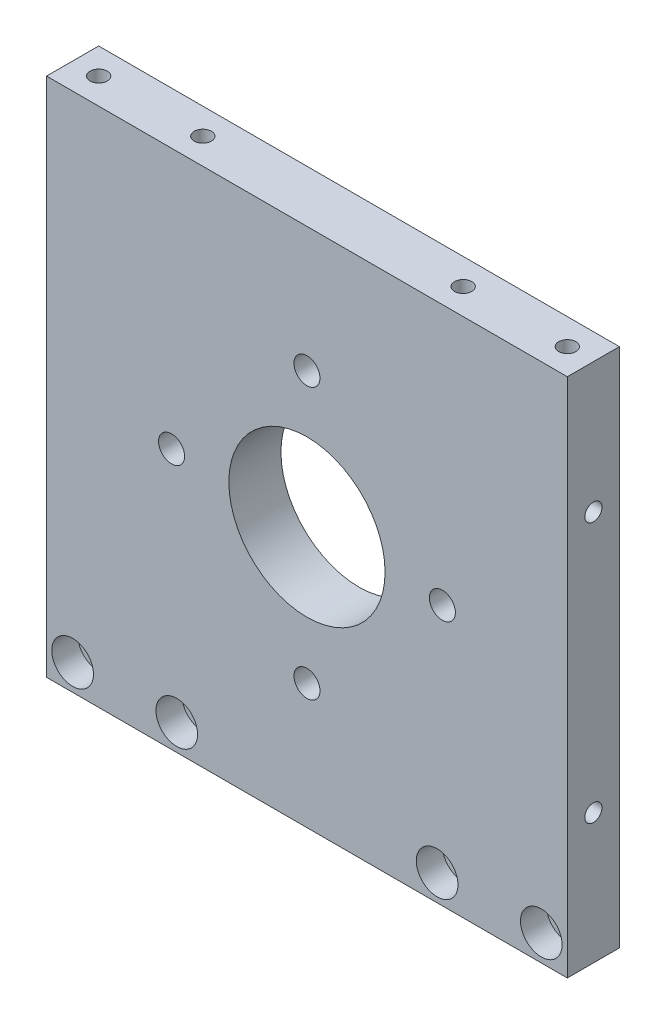
ISO-10303-21;
HEADER;
FILE_DESCRIPTION(('STEP AP214'),'2;1');
FILE_NAME('part.step','',(''),(''),'','','');
FILE_SCHEMA(('AUTOMOTIVE_DESIGN { 1 0 10303 214 1 1 1 1 }'));
ENDSEC;
DATA;
#1=APPLICATION_CONTEXT('core data for automotive mechanical design processes');
#2=APPLICATION_PROTOCOL_DEFINITION('international standard','automotive_design',2000,#1);
#3=PRODUCT_CONTEXT('',#1,'mechanical');
#4=PRODUCT('Part','Part','',(#3));
#5=PRODUCT_RELATED_PRODUCT_CATEGORY('part','',(#4));
#6=PRODUCT_DEFINITION_FORMATION('','',#4);
#7=PRODUCT_DEFINITION_CONTEXT('part definition',#1,'design');
#8=PRODUCT_DEFINITION('design','',#6,#7);
#9=PRODUCT_DEFINITION_SHAPE('','',#8);
#10=(LENGTH_UNIT() NAMED_UNIT(*) SI_UNIT(.MILLI.,.METRE.));
#11=(NAMED_UNIT(*) PLANE_ANGLE_UNIT() SI_UNIT($,.RADIAN.));
#12=(NAMED_UNIT(*) SI_UNIT($,.STERADIAN.) SOLID_ANGLE_UNIT());
#13=UNCERTAINTY_MEASURE_WITH_UNIT(LENGTH_MEASURE(1.E-05),#10,'distance_accuracy_value','');
#14=(GEOMETRIC_REPRESENTATION_CONTEXT(3) GLOBAL_UNCERTAINTY_ASSIGNED_CONTEXT((#13)) GLOBAL_UNIT_ASSIGNED_CONTEXT((#10,
#11,#12)) REPRESENTATION_CONTEXT('',''));
#15=CARTESIAN_POINT('',(0.,0.,0.));
#16=DIRECTION('',(0.,0.,1.));
#17=DIRECTION('',(1.,0.,0.));
#18=AXIS2_PLACEMENT_3D('',#15,#16,#17);
#19=CARTESIAN_POINT('',(50.,50.,-5.));
#20=DIRECTION('',(0.,-1.,0.));
#21=DIRECTION('',(0.,0.,-1.));
#22=AXIS2_PLACEMENT_3D('',#19,#20,#21);
#23=PLANE('',#22);
#24=CARTESIAN_POINT('',(-45.,50.,0.));
#25=DIRECTION('',(0.,1.,0.));
#26=DIRECTION('',(0.,0.,1.));
#27=AXIS2_PLACEMENT_3D('',#24,#25,#26);
#28=CIRCLE('',#27,1.64999999999999);
#29=CARTESIAN_POINT('',(-45.,50.,1.65000000000003));
#30=VERTEX_POINT('',#29);
#31=EDGE_CURVE('E182',#30,#30,#28,.T.);
#32=ORIENTED_EDGE('',*,*,#31,.F.);
#33=EDGE_LOOP('',(#32));
#34=FACE_BOUND('',#33,.T.);
#35=CARTESIAN_POINT('',(-25.,50.,0.));
#36=DIRECTION('',(0.,1.,0.));
#37=DIRECTION('',(0.,0.,1.));
#38=AXIS2_PLACEMENT_3D('',#35,#36,#37);
#39=CIRCLE('',#38,1.64999999999999);
#40=CARTESIAN_POINT('',(-25.,50.,1.65000000000002));
#41=VERTEX_POINT('',#40);
#42=EDGE_CURVE('E190',#41,#41,#39,.T.);
#43=ORIENTED_EDGE('',*,*,#42,.F.);
#44=EDGE_LOOP('',(#43));
#45=FACE_BOUND('',#44,.T.);
#46=CARTESIAN_POINT('',(25.,50.,0.));
#47=DIRECTION('',(0.,1.,0.));
#48=DIRECTION('',(0.,0.,1.));
#49=AXIS2_PLACEMENT_3D('',#46,#47,#48);
#50=CIRCLE('',#49,1.64999999999999);
#51=CARTESIAN_POINT('',(25.,50.,1.65000000000001));
#52=VERTEX_POINT('',#51);
#53=EDGE_CURVE('E198',#52,#52,#50,.T.);
#54=ORIENTED_EDGE('',*,*,#53,.F.);
#55=EDGE_LOOP('',(#54));
#56=FACE_BOUND('',#55,.T.);
#57=CARTESIAN_POINT('',(45.,50.,0.));
#58=DIRECTION('',(0.,1.,0.));
#59=DIRECTION('',(0.,0.,1.));
#60=AXIS2_PLACEMENT_3D('',#57,#58,#59);
#61=CIRCLE('',#60,1.64999999999999);
#62=CARTESIAN_POINT('',(45.,50.,1.65000000000001));
#63=VERTEX_POINT('',#62);
#64=EDGE_CURVE('E206',#63,#63,#61,.T.);
#65=ORIENTED_EDGE('',*,*,#64,.F.);
#66=EDGE_LOOP('',(#65));
#67=FACE_BOUND('',#66,.T.);
#68=DIRECTION('',(0.,0.,1.));
#69=VECTOR('',#68,1.);
#70=CARTESIAN_POINT('',(-50.,50.,-5.));
#71=LINE('',#70,#69);
#72=CARTESIAN_POINT('',(-50.,50.,-5.));
#73=VERTEX_POINT('',#72);
#74=CARTESIAN_POINT('',(-50.,50.,5.));
#75=VERTEX_POINT('',#74);
#76=EDGE_CURVE('E283',#73,#75,#71,.T.);
#77=ORIENTED_EDGE('',*,*,#76,.T.);
#78=DIRECTION('',(-1.,0.,0.));
#79=VECTOR('',#78,1.);
#80=CARTESIAN_POINT('',(50.,50.,5.));
#81=LINE('',#80,#79);
#82=CARTESIAN_POINT('',(50.,50.,5.));
#83=VERTEX_POINT('',#82);
#84=EDGE_CURVE('E11',#83,#75,#81,.T.);
#85=ORIENTED_EDGE('',*,*,#84,.F.);
#86=DIRECTION('',(0.,0.,1.));
#87=VECTOR('',#86,1.);
#88=CARTESIAN_POINT('',(50.,50.,-5.));
#89=LINE('',#88,#87);
#90=CARTESIAN_POINT('',(50.,50.,-5.));
#91=VERTEX_POINT('',#90);
#92=EDGE_CURVE('E287',#91,#83,#89,.T.);
#93=ORIENTED_EDGE('',*,*,#92,.F.);
#94=DIRECTION('',(-1.,0.,0.));
#95=VECTOR('',#94,1.);
#96=CARTESIAN_POINT('',(50.,50.,-5.));
#97=LINE('',#96,#95);
#98=EDGE_CURVE('E297',#91,#73,#97,.T.);
#99=ORIENTED_EDGE('',*,*,#98,.T.);
#100=EDGE_LOOP('',(#77,#85,#93,#99));
#101=FACE_BOUND('',#100,.T.);
#102=ADVANCED_FACE('F57',(#34,#45,#56,#67,#101),#23,.F.);
#103=CARTESIAN_POINT('',(50.,50.,5.));
#104=DIRECTION('',(0.,0.,-1.));
#105=DIRECTION('',(0.,1.,0.));
#106=AXIS2_PLACEMENT_3D('',#103,#104,#105);
#107=PLANE('',#106);
#108=CARTESIAN_POINT('',(0.,26.,5.));
#109=DIRECTION('',(0.,0.,1.));
#110=DIRECTION('',(1.,0.,0.));
#111=AXIS2_PLACEMENT_3D('',#108,#109,#110);
#112=CIRCLE('',#111,2.5);
#113=CARTESIAN_POINT('',(2.49999999999999,26.,5.));
#114=VERTEX_POINT('',#113);
#115=EDGE_CURVE('E914',#114,#114,#112,.T.);
#116=ORIENTED_EDGE('',*,*,#115,.F.);
#117=EDGE_LOOP('',(#116));
#118=FACE_BOUND('',#117,.T.);
#119=CARTESIAN_POINT('',(-26.,0.,5.));
#120=DIRECTION('',(0.,0.,1.));
#121=DIRECTION('',(1.,0.,0.));
#122=AXIS2_PLACEMENT_3D('',#119,#120,#121);
#123=CIRCLE('',#122,2.5);
#124=CARTESIAN_POINT('',(-23.5,0.,5.));
#125=VERTEX_POINT('',#124);
#126=EDGE_CURVE('E918',#125,#125,#123,.T.);
#127=ORIENTED_EDGE('',*,*,#126,.F.);
#128=EDGE_LOOP('',(#127));
#129=FACE_BOUND('',#128,.T.);
#130=CARTESIAN_POINT('',(26.,0.,5.));
#131=DIRECTION('',(0.,0.,1.));
#132=DIRECTION('',(1.,0.,0.));
#133=AXIS2_PLACEMENT_3D('',#130,#131,#132);
#134=CIRCLE('',#133,2.5);
#135=CARTESIAN_POINT('',(28.5,0.,5.));
#136=VERTEX_POINT('',#135);
#137=EDGE_CURVE('E928',#136,#136,#134,.T.);
#138=ORIENTED_EDGE('',*,*,#137,.F.);
#139=EDGE_LOOP('',(#138));
#140=FACE_BOUND('',#139,.T.);
#141=CARTESIAN_POINT('',(0.,-26.,5.));
#142=DIRECTION('',(0.,0.,1.));
#143=DIRECTION('',(1.,0.,0.));
#144=AXIS2_PLACEMENT_3D('',#141,#142,#143);
#145=CIRCLE('',#144,2.5);
#146=CARTESIAN_POINT('',(2.49999999999999,-26.,5.));
#147=VERTEX_POINT('',#146);
#148=EDGE_CURVE('E936',#147,#147,#145,.T.);
#149=ORIENTED_EDGE('',*,*,#148,.F.);
#150=EDGE_LOOP('',(#149));
#151=FACE_BOUND('',#150,.T.);
#152=CARTESIAN_POINT('',(-45.,-45.,5.));
#153=DIRECTION('',(0.,0.,1.));
#154=DIRECTION('',(1.,0.,0.));
#155=AXIS2_PLACEMENT_3D('',#152,#153,#154);
#156=CIRCLE('',#155,4.);
#157=CARTESIAN_POINT('',(-41.,-45.,5.));
#158=VERTEX_POINT('',#157);
#159=EDGE_CURVE('E214',#158,#158,#156,.T.);
#160=ORIENTED_EDGE('',*,*,#159,.F.);
#161=EDGE_LOOP('',(#160));
#162=FACE_BOUND('',#161,.T.);
#163=CARTESIAN_POINT('',(-25.,-45.,5.));
#164=DIRECTION('',(0.,0.,1.));
#165=DIRECTION('',(1.,0.,0.));
#166=AXIS2_PLACEMENT_3D('',#163,#164,#165);
#167=CIRCLE('',#166,4.);
#168=CARTESIAN_POINT('',(-21.,-45.,5.));
#169=VERTEX_POINT('',#168);
#170=EDGE_CURVE('E230',#169,#169,#167,.T.);
#171=ORIENTED_EDGE('',*,*,#170,.F.);
#172=EDGE_LOOP('',(#171));
#173=FACE_BOUND('',#172,.T.);
#174=CARTESIAN_POINT('',(25.,-45.,5.));
#175=DIRECTION('',(0.,0.,1.));
#176=DIRECTION('',(1.,0.,0.));
#177=AXIS2_PLACEMENT_3D('',#174,#175,#176);
#178=CIRCLE('',#177,4.);
#179=CARTESIAN_POINT('',(29.,-45.,5.));
#180=VERTEX_POINT('',#179);
#181=EDGE_CURVE('E246',#180,#180,#178,.T.);
#182=ORIENTED_EDGE('',*,*,#181,.F.);
#183=EDGE_LOOP('',(#182));
#184=FACE_BOUND('',#183,.T.);
#185=CARTESIAN_POINT('',(45.,-45.,5.));
#186=DIRECTION('',(0.,0.,1.));
#187=DIRECTION('',(1.,0.,0.));
#188=AXIS2_PLACEMENT_3D('',#185,#186,#187);
#189=CIRCLE('',#188,4.);
#190=CARTESIAN_POINT('',(49.,-45.,5.));
#191=VERTEX_POINT('',#190);
#192=EDGE_CURVE('E262',#191,#191,#189,.T.);
#193=ORIENTED_EDGE('',*,*,#192,.F.);
#194=EDGE_LOOP('',(#193));
#195=FACE_BOUND('',#194,.T.);
#196=CARTESIAN_POINT('',(0.,0.,5.));
#197=DIRECTION('',(0.,0.,1.));
#198=DIRECTION('',(1.,0.,0.));
#199=AXIS2_PLACEMENT_3D('',#196,#197,#198);
#200=CIRCLE('',#199,15.);
#201=CARTESIAN_POINT('',(15.,0.,5.));
#202=VERTEX_POINT('',#201);
#203=EDGE_CURVE('E278',#202,#202,#200,.T.);
#204=ORIENTED_EDGE('',*,*,#203,.F.);
#205=EDGE_LOOP('',(#204));
#206=FACE_BOUND('',#205,.T.);
#207=DIRECTION('',(0.,-1.,0.));
#208=VECTOR('',#207,1.);
#209=CARTESIAN_POINT('',(-50.,50.,5.));
#210=LINE('',#209,#208);
#211=CARTESIAN_POINT('',(-50.,-50.,4.99999999999999));
#212=VERTEX_POINT('',#211);
#213=EDGE_CURVE('E301',#75,#212,#210,.T.);
#214=ORIENTED_EDGE('',*,*,#213,.T.);
#215=DIRECTION('',(-1.,0.,0.));
#216=VECTOR('',#215,1.);
#217=CARTESIAN_POINT('',(50.,-50.,4.99999999999999));
#218=LINE('',#217,#216);
#219=CARTESIAN_POINT('',(50.,-50.,4.99999999999999));
#220=VERTEX_POINT('',#219);
#221=EDGE_CURVE('E66',#220,#212,#218,.T.);
#222=ORIENTED_EDGE('',*,*,#221,.F.);
#223=DIRECTION('',(0.,-1.,0.));
#224=VECTOR('',#223,1.);
#225=CARTESIAN_POINT('',(50.,50.,5.));
#226=LINE('',#225,#224);
#227=EDGE_CURVE('E111',#83,#220,#226,.T.);
#228=ORIENTED_EDGE('',*,*,#227,.F.);
#229=ORIENTED_EDGE('',*,*,#84,.T.);
#230=EDGE_LOOP('',(#214,#222,#228,#229));
#231=FACE_BOUND('',#230,.T.);
#232=ADVANCED_FACE('F334',(#118,#129,#140,#151,#162,#173,#184,#195,#206,#231),#107,.F.);
#233=CARTESIAN_POINT('',(50.,-50.,4.99999999999999));
#234=DIRECTION('',(0.,1.,0.));
#235=DIRECTION('',(0.,0.,1.));
#236=AXIS2_PLACEMENT_3D('',#233,#234,#235);
#237=PLANE('',#236);
#238=DIRECTION('',(0.,0.,-1.));
#239=VECTOR('',#238,1.);
#240=CARTESIAN_POINT('',(-50.,-50.,4.99999999999999));
#241=LINE('',#240,#239);
#242=CARTESIAN_POINT('',(-50.,-50.,-5.));
#243=VERTEX_POINT('',#242);
#244=EDGE_CURVE('E96',#212,#243,#241,.T.);
#245=ORIENTED_EDGE('',*,*,#244,.T.);
#246=DIRECTION('',(-1.,0.,0.));
#247=VECTOR('',#246,1.);
#248=CARTESIAN_POINT('',(50.,-50.,-5.));
#249=LINE('',#248,#247);
#250=CARTESIAN_POINT('',(50.,-50.,-5.));
#251=VERTEX_POINT('',#250);
#252=EDGE_CURVE('E310',#251,#243,#249,.T.);
#253=ORIENTED_EDGE('',*,*,#252,.F.);
#254=DIRECTION('',(0.,0.,-1.));
#255=VECTOR('',#254,1.);
#256=CARTESIAN_POINT('',(50.,-50.,4.99999999999999));
#257=LINE('',#256,#255);
#258=EDGE_CURVE('E292',#220,#251,#257,.T.);
#259=ORIENTED_EDGE('',*,*,#258,.F.);
#260=ORIENTED_EDGE('',*,*,#221,.T.);
#261=EDGE_LOOP('',(#245,#253,#259,#260));
#262=FACE_BOUND('',#261,.T.);
#263=ADVANCED_FACE('F316',(#262),#237,.F.);
#264=CARTESIAN_POINT('',(50.,-50.,-5.));
#265=DIRECTION('',(0.,0.,1.));
#266=DIRECTION('',(1.,0.,0.));
#267=AXIS2_PLACEMENT_3D('',#264,#265,#266);
#268=PLANE('',#267);
#269=CARTESIAN_POINT('',(0.,26.,-5.));
#270=DIRECTION('',(0.,0.,1.));
#271=DIRECTION('',(1.,0.,0.));
#272=AXIS2_PLACEMENT_3D('',#269,#270,#271);
#273=CIRCLE('',#272,2.5);
#274=CARTESIAN_POINT('',(2.49999999999999,26.,-5.));
#275=VERTEX_POINT('',#274);
#276=EDGE_CURVE('E911',#275,#275,#273,.T.);
#277=ORIENTED_EDGE('',*,*,#276,.T.);
#278=EDGE_LOOP('',(#277));
#279=FACE_BOUND('',#278,.T.);
#280=CARTESIAN_POINT('',(-26.,0.,-5.));
#281=DIRECTION('',(0.,0.,1.));
#282=DIRECTION('',(1.,0.,0.));
#283=AXIS2_PLACEMENT_3D('',#280,#281,#282);
#284=CIRCLE('',#283,2.5);
#285=CARTESIAN_POINT('',(-23.5,0.,-5.));
#286=VERTEX_POINT('',#285);
#287=EDGE_CURVE('E924',#286,#286,#284,.T.);
#288=ORIENTED_EDGE('',*,*,#287,.T.);
#289=EDGE_LOOP('',(#288));
#290=FACE_BOUND('',#289,.T.);
#291=CARTESIAN_POINT('',(26.,0.,-5.));
#292=DIRECTION('',(0.,0.,1.));
#293=DIRECTION('',(1.,0.,0.));
#294=AXIS2_PLACEMENT_3D('',#291,#292,#293);
#295=CIRCLE('',#294,2.5);
#296=CARTESIAN_POINT('',(28.5,0.,-5.));
#297=VERTEX_POINT('',#296);
#298=EDGE_CURVE('E932',#297,#297,#295,.T.);
#299=ORIENTED_EDGE('',*,*,#298,.T.);
#300=EDGE_LOOP('',(#299));
#301=FACE_BOUND('',#300,.T.);
#302=CARTESIAN_POINT('',(0.,-26.,-5.));
#303=DIRECTION('',(0.,0.,1.));
#304=DIRECTION('',(1.,0.,0.));
#305=AXIS2_PLACEMENT_3D('',#302,#303,#304);
#306=CIRCLE('',#305,2.5);
#307=CARTESIAN_POINT('',(2.49999999999999,-26.,-5.));
#308=VERTEX_POINT('',#307);
#309=EDGE_CURVE('E159',#308,#308,#306,.T.);
#310=ORIENTED_EDGE('',*,*,#309,.T.);
#311=EDGE_LOOP('',(#310));
#312=FACE_BOUND('',#311,.T.);
#313=CARTESIAN_POINT('',(-45.,-45.,-5.));
#314=DIRECTION('',(0.,0.,1.));
#315=DIRECTION('',(1.,0.,0.));
#316=AXIS2_PLACEMENT_3D('',#313,#314,#315);
#317=CIRCLE('',#316,2.25);
#318=CARTESIAN_POINT('',(-42.75,-45.,-5.));
#319=VERTEX_POINT('',#318);
#320=EDGE_CURVE('E226',#319,#319,#317,.T.);
#321=ORIENTED_EDGE('',*,*,#320,.T.);
#322=EDGE_LOOP('',(#321));
#323=FACE_BOUND('',#322,.T.);
#324=CARTESIAN_POINT('',(-25.,-45.,-5.));
#325=DIRECTION('',(0.,0.,1.));
#326=DIRECTION('',(1.,0.,0.));
#327=AXIS2_PLACEMENT_3D('',#324,#325,#326);
#328=CIRCLE('',#327,2.25);
#329=CARTESIAN_POINT('',(-22.75,-45.,-5.));
#330=VERTEX_POINT('',#329);
#331=EDGE_CURVE('E242',#330,#330,#328,.T.);
#332=ORIENTED_EDGE('',*,*,#331,.T.);
#333=EDGE_LOOP('',(#332));
#334=FACE_BOUND('',#333,.T.);
#335=CARTESIAN_POINT('',(25.,-45.,-5.));
#336=DIRECTION('',(0.,0.,1.));
#337=DIRECTION('',(1.,0.,0.));
#338=AXIS2_PLACEMENT_3D('',#335,#336,#337);
#339=CIRCLE('',#338,2.25);
#340=CARTESIAN_POINT('',(27.25,-45.,-5.));
#341=VERTEX_POINT('',#340);
#342=EDGE_CURVE('E258',#341,#341,#339,.T.);
#343=ORIENTED_EDGE('',*,*,#342,.T.);
#344=EDGE_LOOP('',(#343));
#345=FACE_BOUND('',#344,.T.);
#346=CARTESIAN_POINT('',(45.,-45.,-5.));
#347=DIRECTION('',(0.,0.,1.));
#348=DIRECTION('',(1.,0.,0.));
#349=AXIS2_PLACEMENT_3D('',#346,#347,#348);
#350=CIRCLE('',#349,2.25);
#351=CARTESIAN_POINT('',(47.25,-45.,-5.));
#352=VERTEX_POINT('',#351);
#353=EDGE_CURVE('E274',#352,#352,#350,.T.);
#354=ORIENTED_EDGE('',*,*,#353,.T.);
#355=EDGE_LOOP('',(#354));
#356=FACE_BOUND('',#355,.T.);
#357=CARTESIAN_POINT('',(0.,0.,-5.));
#358=DIRECTION('',(0.,0.,1.));
#359=DIRECTION('',(1.,0.,0.));
#360=AXIS2_PLACEMENT_3D('',#357,#358,#359);
#361=CIRCLE('',#360,15.);
#362=CARTESIAN_POINT('',(15.,0.,-5.));
#363=VERTEX_POINT('',#362);
#364=EDGE_CURVE('E279',#363,#363,#361,.T.);
#365=ORIENTED_EDGE('',*,*,#364,.T.);
#366=EDGE_LOOP('',(#365));
#367=FACE_BOUND('',#366,.T.);
#368=DIRECTION('',(0.,1.,0.));
#369=VECTOR('',#368,1.);
#370=CARTESIAN_POINT('',(-50.,-50.,-5.));
#371=LINE('',#370,#369);
#372=EDGE_CURVE('E104',#243,#73,#371,.T.);
#373=ORIENTED_EDGE('',*,*,#372,.T.);
#374=ORIENTED_EDGE('',*,*,#98,.F.);
#375=DIRECTION('',(0.,1.,0.));
#376=VECTOR('',#375,1.);
#377=CARTESIAN_POINT('',(50.,-50.,-5.));
#378=LINE('',#377,#376);
#379=EDGE_CURVE('E74',#251,#91,#378,.T.);
#380=ORIENTED_EDGE('',*,*,#379,.F.);
#381=ORIENTED_EDGE('',*,*,#252,.T.);
#382=EDGE_LOOP('',(#373,#374,#380,#381));
#383=FACE_BOUND('',#382,.T.);
#384=ADVANCED_FACE('F323',(#279,#290,#301,#312,#323,#334,#345,#356,#367,#383),#268,.F.);
#385=CARTESIAN_POINT('',(50.,0.,0.));
#386=DIRECTION('',(1.,0.,0.));
#387=DIRECTION('',(0.,0.,-1.));
#388=AXIS2_PLACEMENT_3D('',#385,#386,#387);
#389=PLANE('',#388);
#390=CARTESIAN_POINT('',(50.,25.,0.));
#391=DIRECTION('',(1.,0.,0.));
#392=DIRECTION('',(0.,0.,-1.));
#393=AXIS2_PLACEMENT_3D('',#390,#391,#392);
#394=CIRCLE('',#393,1.64999999999999);
#395=CARTESIAN_POINT('',(50.,25.,-1.65));
#396=VERTEX_POINT('',#395);
#397=EDGE_CURVE('E150',#396,#396,#394,.T.);
#398=ORIENTED_EDGE('',*,*,#397,.F.);
#399=EDGE_LOOP('',(#398));
#400=FACE_BOUND('',#399,.T.);
#401=CARTESIAN_POINT('',(50.,-25.,0.));
#402=DIRECTION('',(1.,0.,0.));
#403=DIRECTION('',(0.,0.,-1.));
#404=AXIS2_PLACEMENT_3D('',#401,#402,#403);
#405=CIRCLE('',#404,1.64999999999999);
#406=CARTESIAN_POINT('',(50.,-25.,-1.64999999999999));
#407=VERTEX_POINT('',#406);
#408=EDGE_CURVE('E149',#407,#407,#405,.T.);
#409=ORIENTED_EDGE('',*,*,#408,.F.);
#410=EDGE_LOOP('',(#409));
#411=FACE_BOUND('',#410,.T.);
#412=ORIENTED_EDGE('',*,*,#92,.T.);
#413=ORIENTED_EDGE('',*,*,#227,.T.);
#414=ORIENTED_EDGE('',*,*,#258,.T.);
#415=ORIENTED_EDGE('',*,*,#379,.T.);
#416=EDGE_LOOP('',(#412,#413,#414,#415));
#417=FACE_BOUND('',#416,.T.);
#418=ADVANCED_FACE('F325',(#400,#411,#417),#389,.T.);
#419=CARTESIAN_POINT('',(-50.,0.,0.));
#420=DIRECTION('',(1.,0.,0.));
#421=DIRECTION('',(0.,0.,-1.));
#422=AXIS2_PLACEMENT_3D('',#419,#420,#421);
#423=PLANE('',#422);
#424=CARTESIAN_POINT('',(-50.,25.,0.));
#425=DIRECTION('',(-1.,0.,0.));
#426=DIRECTION('',(0.,0.,1.));
#427=AXIS2_PLACEMENT_3D('',#424,#425,#426);
#428=CIRCLE('',#427,1.64999999999999);
#429=CARTESIAN_POINT('',(-50.,25.,1.64999999999998));
#430=VERTEX_POINT('',#429);
#431=EDGE_CURVE('E166',#430,#430,#428,.T.);
#432=ORIENTED_EDGE('',*,*,#431,.F.);
#433=EDGE_LOOP('',(#432));
#434=FACE_BOUND('',#433,.T.);
#435=CARTESIAN_POINT('',(-50.,-25.,0.));
#436=DIRECTION('',(-1.,0.,0.));
#437=DIRECTION('',(0.,0.,1.));
#438=AXIS2_PLACEMENT_3D('',#435,#436,#437);
#439=CIRCLE('',#438,1.64999999999999);
#440=CARTESIAN_POINT('',(-50.,-25.,1.65));
#441=VERTEX_POINT('',#440);
#442=EDGE_CURVE('E174',#441,#441,#439,.T.);
#443=ORIENTED_EDGE('',*,*,#442,.F.);
#444=EDGE_LOOP('',(#443));
#445=FACE_BOUND('',#444,.T.);
#446=ORIENTED_EDGE('',*,*,#76,.F.);
#447=ORIENTED_EDGE('',*,*,#372,.F.);
#448=ORIENTED_EDGE('',*,*,#244,.F.);
#449=ORIENTED_EDGE('',*,*,#213,.F.);
#450=EDGE_LOOP('',(#446,#447,#448,#449));
#451=FACE_BOUND('',#450,.T.);
#452=ADVANCED_FACE('F319',(#434,#445,#451),#423,.F.);
#453=CARTESIAN_POINT('',(0.,0.,-5.));
#454=DIRECTION('',(0.,0.,1.));
#455=DIRECTION('',(1.,0.,0.));
#456=AXIS2_PLACEMENT_3D('',#453,#454,#455);
#457=CYLINDRICAL_SURFACE('',#456,15.);
#458=ORIENTED_EDGE('',*,*,#364,.F.);
#459=EDGE_LOOP('',(#458));
#460=FACE_BOUND('',#459,.T.);
#461=ORIENTED_EDGE('',*,*,#203,.T.);
#462=EDGE_LOOP('',(#461));
#463=FACE_BOUND('',#462,.T.);
#464=ADVANCED_FACE('F420',(#460,#463),#457,.F.);
#465=CARTESIAN_POINT('',(45.,-45.,5.));
#466=DIRECTION('',(0.,0.,1.));
#467=DIRECTION('',(1.,0.,0.));
#468=AXIS2_PLACEMENT_3D('',#465,#466,#467);
#469=CYLINDRICAL_SURFACE('',#468,2.25);
#470=ORIENTED_EDGE('',*,*,#353,.F.);
#471=EDGE_LOOP('',(#470));
#472=FACE_BOUND('',#471,.T.);
#473=CARTESIAN_POINT('',(45.,-45.,0.));
#474=DIRECTION('',(0.,0.,1.));
#475=DIRECTION('',(1.,0.,0.));
#476=AXIS2_PLACEMENT_3D('',#473,#474,#475);
#477=CIRCLE('',#476,2.25);
#478=CARTESIAN_POINT('',(47.25,-45.,0.));
#479=VERTEX_POINT('',#478);
#480=EDGE_CURVE('E270',#479,#479,#477,.T.);
#481=ORIENTED_EDGE('',*,*,#480,.T.);
#482=EDGE_LOOP('',(#481));
#483=FACE_BOUND('',#482,.T.);
#484=ADVANCED_FACE('F416',(#472,#483),#469,.F.);
#485=CARTESIAN_POINT('',(47.25,-45.,0.));
#486=DIRECTION('',(0.,0.,-1.));
#487=DIRECTION('',(-1.,0.,0.));
#488=AXIS2_PLACEMENT_3D('',#485,#486,#487);
#489=PLANE('',#488);
#490=ORIENTED_EDGE('',*,*,#480,.F.);
#491=EDGE_LOOP('',(#490));
#492=FACE_BOUND('',#491,.T.);
#493=CARTESIAN_POINT('',(45.,-45.,0.));
#494=DIRECTION('',(0.,0.,1.));
#495=DIRECTION('',(1.,0.,0.));
#496=AXIS2_PLACEMENT_3D('',#493,#494,#495);
#497=CIRCLE('',#496,4.);
#498=CARTESIAN_POINT('',(49.,-45.,0.));
#499=VERTEX_POINT('',#498);
#500=EDGE_CURVE('E266',#499,#499,#497,.T.);
#501=ORIENTED_EDGE('',*,*,#500,.T.);
#502=EDGE_LOOP('',(#501));
#503=FACE_BOUND('',#502,.T.);
#504=ADVANCED_FACE('F412',(#492,#503),#489,.F.);
#505=CARTESIAN_POINT('',(45.,-45.,5.));
#506=DIRECTION('',(0.,0.,1.));
#507=DIRECTION('',(1.,0.,0.));
#508=AXIS2_PLACEMENT_3D('',#505,#506,#507);
#509=CYLINDRICAL_SURFACE('',#508,4.);
#510=ORIENTED_EDGE('',*,*,#500,.F.);
#511=EDGE_LOOP('',(#510));
#512=FACE_BOUND('',#511,.T.);
#513=ORIENTED_EDGE('',*,*,#192,.T.);
#514=EDGE_LOOP('',(#513));
#515=FACE_BOUND('',#514,.T.);
#516=ADVANCED_FACE('F408',(#512,#515),#509,.F.);
#517=CARTESIAN_POINT('',(25.,-45.,5.));
#518=DIRECTION('',(0.,0.,1.));
#519=DIRECTION('',(1.,0.,0.));
#520=AXIS2_PLACEMENT_3D('',#517,#518,#519);
#521=CYLINDRICAL_SURFACE('',#520,2.25);
#522=ORIENTED_EDGE('',*,*,#342,.F.);
#523=EDGE_LOOP('',(#522));
#524=FACE_BOUND('',#523,.T.);
#525=CARTESIAN_POINT('',(25.,-45.,0.));
#526=DIRECTION('',(0.,0.,1.));
#527=DIRECTION('',(1.,0.,0.));
#528=AXIS2_PLACEMENT_3D('',#525,#526,#527);
#529=CIRCLE('',#528,2.25);
#530=CARTESIAN_POINT('',(27.25,-45.,0.));
#531=VERTEX_POINT('',#530);
#532=EDGE_CURVE('E254',#531,#531,#529,.T.);
#533=ORIENTED_EDGE('',*,*,#532,.T.);
#534=EDGE_LOOP('',(#533));
#535=FACE_BOUND('',#534,.T.);
#536=ADVANCED_FACE('F404',(#524,#535),#521,.F.);
#537=CARTESIAN_POINT('',(27.25,-45.,0.));
#538=DIRECTION('',(0.,0.,-1.));
#539=DIRECTION('',(-1.,0.,0.));
#540=AXIS2_PLACEMENT_3D('',#537,#538,#539);
#541=PLANE('',#540);
#542=ORIENTED_EDGE('',*,*,#532,.F.);
#543=EDGE_LOOP('',(#542));
#544=FACE_BOUND('',#543,.T.);
#545=CARTESIAN_POINT('',(25.,-45.,0.));
#546=DIRECTION('',(0.,0.,1.));
#547=DIRECTION('',(1.,0.,0.));
#548=AXIS2_PLACEMENT_3D('',#545,#546,#547);
#549=CIRCLE('',#548,4.);
#550=CARTESIAN_POINT('',(29.,-45.,0.));
#551=VERTEX_POINT('',#550);
#552=EDGE_CURVE('E250',#551,#551,#549,.T.);
#553=ORIENTED_EDGE('',*,*,#552,.T.);
#554=EDGE_LOOP('',(#553));
#555=FACE_BOUND('',#554,.T.);
#556=ADVANCED_FACE('F400',(#544,#555),#541,.F.);
#557=CARTESIAN_POINT('',(25.,-45.,5.));
#558=DIRECTION('',(0.,0.,1.));
#559=DIRECTION('',(1.,0.,0.));
#560=AXIS2_PLACEMENT_3D('',#557,#558,#559);
#561=CYLINDRICAL_SURFACE('',#560,4.);
#562=ORIENTED_EDGE('',*,*,#552,.F.);
#563=EDGE_LOOP('',(#562));
#564=FACE_BOUND('',#563,.T.);
#565=ORIENTED_EDGE('',*,*,#181,.T.);
#566=EDGE_LOOP('',(#565));
#567=FACE_BOUND('',#566,.T.);
#568=ADVANCED_FACE('F396',(#564,#567),#561,.F.);
#569=CARTESIAN_POINT('',(-25.,-45.,5.));
#570=DIRECTION('',(0.,0.,1.));
#571=DIRECTION('',(1.,0.,0.));
#572=AXIS2_PLACEMENT_3D('',#569,#570,#571);
#573=CYLINDRICAL_SURFACE('',#572,2.25);
#574=ORIENTED_EDGE('',*,*,#331,.F.);
#575=EDGE_LOOP('',(#574));
#576=FACE_BOUND('',#575,.T.);
#577=CARTESIAN_POINT('',(-25.,-45.,0.));
#578=DIRECTION('',(0.,0.,1.));
#579=DIRECTION('',(1.,0.,0.));
#580=AXIS2_PLACEMENT_3D('',#577,#578,#579);
#581=CIRCLE('',#580,2.25);
#582=CARTESIAN_POINT('',(-22.75,-45.,0.));
#583=VERTEX_POINT('',#582);
#584=EDGE_CURVE('E238',#583,#583,#581,.T.);
#585=ORIENTED_EDGE('',*,*,#584,.T.);
#586=EDGE_LOOP('',(#585));
#587=FACE_BOUND('',#586,.T.);
#588=ADVANCED_FACE('F392',(#576,#587),#573,.F.);
#589=CARTESIAN_POINT('',(-22.75,-45.,0.));
#590=DIRECTION('',(0.,0.,-1.));
#591=DIRECTION('',(-1.,0.,0.));
#592=AXIS2_PLACEMENT_3D('',#589,#590,#591);
#593=PLANE('',#592);
#594=ORIENTED_EDGE('',*,*,#584,.F.);
#595=EDGE_LOOP('',(#594));
#596=FACE_BOUND('',#595,.T.);
#597=CARTESIAN_POINT('',(-25.,-45.,0.));
#598=DIRECTION('',(0.,0.,1.));
#599=DIRECTION('',(1.,0.,0.));
#600=AXIS2_PLACEMENT_3D('',#597,#598,#599);
#601=CIRCLE('',#600,4.);
#602=CARTESIAN_POINT('',(-21.,-45.,0.));
#603=VERTEX_POINT('',#602);
#604=EDGE_CURVE('E234',#603,#603,#601,.T.);
#605=ORIENTED_EDGE('',*,*,#604,.T.);
#606=EDGE_LOOP('',(#605));
#607=FACE_BOUND('',#606,.T.);
#608=ADVANCED_FACE('F388',(#596,#607),#593,.F.);
#609=CARTESIAN_POINT('',(-25.,-45.,5.));
#610=DIRECTION('',(0.,0.,1.));
#611=DIRECTION('',(1.,0.,0.));
#612=AXIS2_PLACEMENT_3D('',#609,#610,#611);
#613=CYLINDRICAL_SURFACE('',#612,4.);
#614=ORIENTED_EDGE('',*,*,#604,.F.);
#615=EDGE_LOOP('',(#614));
#616=FACE_BOUND('',#615,.T.);
#617=ORIENTED_EDGE('',*,*,#170,.T.);
#618=EDGE_LOOP('',(#617));
#619=FACE_BOUND('',#618,.T.);
#620=ADVANCED_FACE('F384',(#616,#619),#613,.F.);
#621=CARTESIAN_POINT('',(-45.,-45.,5.));
#622=DIRECTION('',(0.,0.,1.));
#623=DIRECTION('',(1.,0.,0.));
#624=AXIS2_PLACEMENT_3D('',#621,#622,#623);
#625=CYLINDRICAL_SURFACE('',#624,2.25);
#626=ORIENTED_EDGE('',*,*,#320,.F.);
#627=EDGE_LOOP('',(#626));
#628=FACE_BOUND('',#627,.T.);
#629=CARTESIAN_POINT('',(-45.,-45.,0.));
#630=DIRECTION('',(0.,0.,1.));
#631=DIRECTION('',(1.,0.,0.));
#632=AXIS2_PLACEMENT_3D('',#629,#630,#631);
#633=CIRCLE('',#632,2.25);
#634=CARTESIAN_POINT('',(-42.75,-45.,0.));
#635=VERTEX_POINT('',#634);
#636=EDGE_CURVE('E222',#635,#635,#633,.T.);
#637=ORIENTED_EDGE('',*,*,#636,.T.);
#638=EDGE_LOOP('',(#637));
#639=FACE_BOUND('',#638,.T.);
#640=ADVANCED_FACE('F380',(#628,#639),#625,.F.);
#641=CARTESIAN_POINT('',(-42.75,-45.,0.));
#642=DIRECTION('',(0.,0.,-1.));
#643=DIRECTION('',(-1.,0.,0.));
#644=AXIS2_PLACEMENT_3D('',#641,#642,#643);
#645=PLANE('',#644);
#646=ORIENTED_EDGE('',*,*,#636,.F.);
#647=EDGE_LOOP('',(#646));
#648=FACE_BOUND('',#647,.T.);
#649=CARTESIAN_POINT('',(-45.,-45.,0.));
#650=DIRECTION('',(0.,0.,1.));
#651=DIRECTION('',(1.,0.,0.));
#652=AXIS2_PLACEMENT_3D('',#649,#650,#651);
#653=CIRCLE('',#652,4.);
#654=CARTESIAN_POINT('',(-41.,-45.,0.));
#655=VERTEX_POINT('',#654);
#656=EDGE_CURVE('E218',#655,#655,#653,.T.);
#657=ORIENTED_EDGE('',*,*,#656,.T.);
#658=EDGE_LOOP('',(#657));
#659=FACE_BOUND('',#658,.T.);
#660=ADVANCED_FACE('F376',(#648,#659),#645,.F.);
#661=CARTESIAN_POINT('',(-45.,-45.,5.));
#662=DIRECTION('',(0.,0.,1.));
#663=DIRECTION('',(1.,0.,0.));
#664=AXIS2_PLACEMENT_3D('',#661,#662,#663);
#665=CYLINDRICAL_SURFACE('',#664,4.);
#666=ORIENTED_EDGE('',*,*,#656,.F.);
#667=EDGE_LOOP('',(#666));
#668=FACE_BOUND('',#667,.T.);
#669=ORIENTED_EDGE('',*,*,#159,.T.);
#670=EDGE_LOOP('',(#669));
#671=FACE_BOUND('',#670,.T.);
#672=ADVANCED_FACE('F368',(#668,#671),#665,.F.);
#673=CARTESIAN_POINT('',(45.,39.,0.));
#674=DIRECTION('',(0.,1.,0.));
#675=DIRECTION('',(0.,0.,1.));
#676=AXIS2_PLACEMENT_3D('',#673,#674,#675);
#677=CONICAL_SURFACE('',#676,1.64999999999999,1.02974425867665);
#678=CARTESIAN_POINT('',(45.,38.0085799786045,0.));
#679=VERTEX_POINT('',#678);
#680=VERTEX_LOOP('',#679);
#681=FACE_BOUND('',#680,.T.);
#682=CARTESIAN_POINT('',(45.,39.,0.));
#683=DIRECTION('',(0.,1.,0.));
#684=DIRECTION('',(0.,0.,1.));
#685=AXIS2_PLACEMENT_3D('',#682,#683,#684);
#686=CIRCLE('',#685,1.64999999999999);
#687=CARTESIAN_POINT('',(45.,39.,1.65));
#688=VERTEX_POINT('',#687);
#689=EDGE_CURVE('E210',#688,#688,#686,.T.);
#690=ORIENTED_EDGE('',*,*,#689,.T.);
#691=EDGE_LOOP('',(#690));
#692=FACE_BOUND('',#691,.T.);
#693=ADVANCED_FACE('F357',(#681,#692),#677,.F.);
#694=CARTESIAN_POINT('',(45.,50.,0.));
#695=DIRECTION('',(0.,1.,0.));
#696=DIRECTION('',(0.,0.,1.));
#697=AXIS2_PLACEMENT_3D('',#694,#695,#696);
#698=CYLINDRICAL_SURFACE('',#697,1.64999999999999);
#699=ORIENTED_EDGE('',*,*,#689,.F.);
#700=EDGE_LOOP('',(#699));
#701=FACE_BOUND('',#700,.T.);
#702=ORIENTED_EDGE('',*,*,#64,.T.);
#703=EDGE_LOOP('',(#702));
#704=FACE_BOUND('',#703,.T.);
#705=ADVANCED_FACE('F354',(#701,#704),#698,.F.);
#706=CARTESIAN_POINT('',(25.,39.,0.));
#707=DIRECTION('',(0.,1.,0.));
#708=DIRECTION('',(0.,0.,1.));
#709=AXIS2_PLACEMENT_3D('',#706,#707,#708);
#710=CONICAL_SURFACE('',#709,1.64999999999999,1.02974425867665);
#711=CARTESIAN_POINT('',(25.,38.0085799786045,0.));
#712=VERTEX_POINT('',#711);
#713=VERTEX_LOOP('',#712);
#714=FACE_BOUND('',#713,.T.);
#715=CARTESIAN_POINT('',(25.,39.,0.));
#716=DIRECTION('',(0.,1.,0.));
#717=DIRECTION('',(0.,0.,1.));
#718=AXIS2_PLACEMENT_3D('',#715,#716,#717);
#719=CIRCLE('',#718,1.64999999999999);
#720=CARTESIAN_POINT('',(25.,39.,1.65000000000001));
#721=VERTEX_POINT('',#720);
#722=EDGE_CURVE('E202',#721,#721,#719,.T.);
#723=ORIENTED_EDGE('',*,*,#722,.T.);
#724=EDGE_LOOP('',(#723));
#725=FACE_BOUND('',#724,.T.);
#726=ADVANCED_FACE('F356',(#714,#725),#710,.F.);
#727=CARTESIAN_POINT('',(25.,50.,0.));
#728=DIRECTION('',(0.,1.,0.));
#729=DIRECTION('',(0.,0.,1.));
#730=AXIS2_PLACEMENT_3D('',#727,#728,#729);
#731=CYLINDRICAL_SURFACE('',#730,1.64999999999999);
#732=ORIENTED_EDGE('',*,*,#722,.F.);
#733=EDGE_LOOP('',(#732));
#734=FACE_BOUND('',#733,.T.);
#735=ORIENTED_EDGE('',*,*,#53,.T.);
#736=EDGE_LOOP('',(#735));
#737=FACE_BOUND('',#736,.T.);
#738=ADVANCED_FACE('F364',(#734,#737),#731,.F.);
#739=CARTESIAN_POINT('',(-25.,39.,0.));
#740=DIRECTION('',(0.,1.,0.));
#741=DIRECTION('',(0.,0.,1.));
#742=AXIS2_PLACEMENT_3D('',#739,#740,#741);
#743=CONICAL_SURFACE('',#742,1.64999999999999,1.02974425867665);
#744=CARTESIAN_POINT('',(-25.,38.0085799786045,0.));
#745=VERTEX_POINT('',#744);
#746=VERTEX_LOOP('',#745);
#747=FACE_BOUND('',#746,.T.);
#748=CARTESIAN_POINT('',(-25.,39.,0.));
#749=DIRECTION('',(0.,1.,0.));
#750=DIRECTION('',(0.,0.,1.));
#751=AXIS2_PLACEMENT_3D('',#748,#749,#750);
#752=CIRCLE('',#751,1.64999999999999);
#753=CARTESIAN_POINT('',(-25.,39.,1.65000000000002));
#754=VERTEX_POINT('',#753);
#755=EDGE_CURVE('E194',#754,#754,#752,.T.);
#756=ORIENTED_EDGE('',*,*,#755,.T.);
#757=EDGE_LOOP('',(#756));
#758=FACE_BOUND('',#757,.T.);
#759=ADVANCED_FACE('F460',(#747,#758),#743,.F.);
#760=CARTESIAN_POINT('',(-25.,50.,0.));
#761=DIRECTION('',(0.,1.,0.));
#762=DIRECTION('',(0.,0.,1.));
#763=AXIS2_PLACEMENT_3D('',#760,#761,#762);
#764=CYLINDRICAL_SURFACE('',#763,1.64999999999999);
#765=ORIENTED_EDGE('',*,*,#755,.F.);
#766=EDGE_LOOP('',(#765));
#767=FACE_BOUND('',#766,.T.);
#768=ORIENTED_EDGE('',*,*,#42,.T.);
#769=EDGE_LOOP('',(#768));
#770=FACE_BOUND('',#769,.T.);
#771=ADVANCED_FACE('F456',(#767,#770),#764,.F.);
#772=CARTESIAN_POINT('',(-45.,39.,0.));
#773=DIRECTION('',(0.,1.,0.));
#774=DIRECTION('',(0.,0.,1.));
#775=AXIS2_PLACEMENT_3D('',#772,#773,#774);
#776=CONICAL_SURFACE('',#775,1.64999999999999,1.02974425867665);
#777=CARTESIAN_POINT('',(-45.,38.0085799786045,0.));
#778=VERTEX_POINT('',#777);
#779=VERTEX_LOOP('',#778);
#780=FACE_BOUND('',#779,.T.);
#781=CARTESIAN_POINT('',(-45.,39.,0.));
#782=DIRECTION('',(0.,1.,0.));
#783=DIRECTION('',(0.,0.,1.));
#784=AXIS2_PLACEMENT_3D('',#781,#782,#783);
#785=CIRCLE('',#784,1.64999999999999);
#786=CARTESIAN_POINT('',(-45.,39.,1.65000000000002));
#787=VERTEX_POINT('',#786);
#788=EDGE_CURVE('E186',#787,#787,#785,.T.);
#789=ORIENTED_EDGE('',*,*,#788,.T.);
#790=EDGE_LOOP('',(#789));
#791=FACE_BOUND('',#790,.T.);
#792=ADVANCED_FACE('F452',(#780,#791),#776,.F.);
#793=CARTESIAN_POINT('',(-45.,50.,0.));
#794=DIRECTION('',(0.,1.,0.));
#795=DIRECTION('',(0.,0.,1.));
#796=AXIS2_PLACEMENT_3D('',#793,#794,#795);
#797=CYLINDRICAL_SURFACE('',#796,1.64999999999999);
#798=ORIENTED_EDGE('',*,*,#788,.F.);
#799=EDGE_LOOP('',(#798));
#800=FACE_BOUND('',#799,.T.);
#801=ORIENTED_EDGE('',*,*,#31,.T.);
#802=EDGE_LOOP('',(#801));
#803=FACE_BOUND('',#802,.T.);
#804=ADVANCED_FACE('F445',(#800,#803),#797,.F.);
#805=CARTESIAN_POINT('',(-39.,-25.,0.));
#806=DIRECTION('',(-1.,0.,0.));
#807=DIRECTION('',(0.,0.,1.));
#808=AXIS2_PLACEMENT_3D('',#805,#806,#807);
#809=CONICAL_SURFACE('',#808,1.64999999999999,1.02974425867665);
#810=CARTESIAN_POINT('',(-38.0085799786045,-25.,0.));
#811=VERTEX_POINT('',#810);
#812=VERTEX_LOOP('',#811);
#813=FACE_BOUND('',#812,.T.);
#814=CARTESIAN_POINT('',(-39.,-25.,0.));
#815=DIRECTION('',(-1.,0.,0.));
#816=DIRECTION('',(0.,0.,1.));
#817=AXIS2_PLACEMENT_3D('',#814,#815,#816);
#818=CIRCLE('',#817,1.64999999999999);
#819=CARTESIAN_POINT('',(-39.,-25.,1.64999999999999));
#820=VERTEX_POINT('',#819);
#821=EDGE_CURVE('E178',#820,#820,#818,.T.);
#822=ORIENTED_EDGE('',*,*,#821,.T.);
#823=EDGE_LOOP('',(#822));
#824=FACE_BOUND('',#823,.T.);
#825=ADVANCED_FACE('F433',(#813,#824),#809,.F.);
#826=CARTESIAN_POINT('',(-50.,-25.,0.));
#827=DIRECTION('',(-1.,0.,0.));
#828=DIRECTION('',(0.,0.,1.));
#829=AXIS2_PLACEMENT_3D('',#826,#827,#828);
#830=CYLINDRICAL_SURFACE('',#829,1.64999999999999);
#831=ORIENTED_EDGE('',*,*,#821,.F.);
#832=EDGE_LOOP('',(#831));
#833=FACE_BOUND('',#832,.T.);
#834=ORIENTED_EDGE('',*,*,#442,.T.);
#835=EDGE_LOOP('',(#834));
#836=FACE_BOUND('',#835,.T.);
#837=ADVANCED_FACE('F430',(#833,#836),#830,.F.);
#838=CARTESIAN_POINT('',(-39.,25.,0.));
#839=DIRECTION('',(-1.,0.,0.));
#840=DIRECTION('',(0.,0.,1.));
#841=AXIS2_PLACEMENT_3D('',#838,#839,#840);
#842=CONICAL_SURFACE('',#841,1.64999999999999,1.02974425867665);
#843=CARTESIAN_POINT('',(-38.0085799786045,25.,0.));
#844=VERTEX_POINT('',#843);
#845=VERTEX_LOOP('',#844);
#846=FACE_BOUND('',#845,.T.);
#847=CARTESIAN_POINT('',(-39.,25.,0.));
#848=DIRECTION('',(-1.,0.,0.));
#849=DIRECTION('',(0.,0.,1.));
#850=AXIS2_PLACEMENT_3D('',#847,#848,#849);
#851=CIRCLE('',#850,1.64999999999999);
#852=CARTESIAN_POINT('',(-39.,25.,1.64999999999998));
#853=VERTEX_POINT('',#852);
#854=EDGE_CURVE('E170',#853,#853,#851,.T.);
#855=ORIENTED_EDGE('',*,*,#854,.T.);
#856=EDGE_LOOP('',(#855));
#857=FACE_BOUND('',#856,.T.);
#858=ADVANCED_FACE('F432',(#846,#857),#842,.F.);
#859=CARTESIAN_POINT('',(-50.,25.,0.));
#860=DIRECTION('',(-1.,0.,0.));
#861=DIRECTION('',(0.,0.,1.));
#862=AXIS2_PLACEMENT_3D('',#859,#860,#861);
#863=CYLINDRICAL_SURFACE('',#862,1.64999999999999);
#864=ORIENTED_EDGE('',*,*,#854,.F.);
#865=EDGE_LOOP('',(#864));
#866=FACE_BOUND('',#865,.T.);
#867=ORIENTED_EDGE('',*,*,#431,.T.);
#868=EDGE_LOOP('',(#867));
#869=FACE_BOUND('',#868,.T.);
#870=ADVANCED_FACE('F441',(#866,#869),#863,.F.);
#871=CARTESIAN_POINT('',(39.,-25.,0.));
#872=DIRECTION('',(1.,0.,0.));
#873=DIRECTION('',(0.,0.,-1.));
#874=AXIS2_PLACEMENT_3D('',#871,#872,#873);
#875=CONICAL_SURFACE('',#874,1.64999999999999,1.02974425867665);
#876=CARTESIAN_POINT('',(38.0085799786045,-25.,0.));
#877=VERTEX_POINT('',#876);
#878=VERTEX_LOOP('',#877);
#879=FACE_BOUND('',#878,.T.);
#880=CARTESIAN_POINT('',(39.,-25.,0.));
#881=DIRECTION('',(1.,0.,0.));
#882=DIRECTION('',(0.,0.,-1.));
#883=AXIS2_PLACEMENT_3D('',#880,#881,#882);
#884=CIRCLE('',#883,1.64999999999999);
#885=CARTESIAN_POINT('',(39.,-25.,-1.64999999999998));
#886=VERTEX_POINT('',#885);
#887=EDGE_CURVE('E156',#886,#886,#884,.T.);
#888=ORIENTED_EDGE('',*,*,#887,.T.);
#889=EDGE_LOOP('',(#888));
#890=FACE_BOUND('',#889,.T.);
#891=ADVANCED_FACE('F490',(#879,#890),#875,.F.);
#892=CARTESIAN_POINT('',(50.,-25.,0.));
#893=DIRECTION('',(1.,0.,0.));
#894=DIRECTION('',(0.,0.,-1.));
#895=AXIS2_PLACEMENT_3D('',#892,#893,#894);
#896=CYLINDRICAL_SURFACE('',#895,1.64999999999999);
#897=ORIENTED_EDGE('',*,*,#887,.F.);
#898=EDGE_LOOP('',(#897));
#899=FACE_BOUND('',#898,.T.);
#900=ORIENTED_EDGE('',*,*,#408,.T.);
#901=EDGE_LOOP('',(#900));
#902=FACE_BOUND('',#901,.T.);
#903=ADVANCED_FACE('F142',(#899,#902),#896,.F.);
#904=CARTESIAN_POINT('',(39.,25.,0.));
#905=DIRECTION('',(1.,0.,0.));
#906=DIRECTION('',(0.,0.,-1.));
#907=AXIS2_PLACEMENT_3D('',#904,#905,#906);
#908=CONICAL_SURFACE('',#907,1.64999999999999,1.02974425867665);
#909=CARTESIAN_POINT('',(38.0085799786045,25.,0.));
#910=VERTEX_POINT('',#909);
#911=VERTEX_LOOP('',#910);
#912=FACE_BOUND('',#911,.T.);
#913=CARTESIAN_POINT('',(39.,25.,0.));
#914=DIRECTION('',(1.,0.,0.));
#915=DIRECTION('',(0.,0.,-1.));
#916=AXIS2_PLACEMENT_3D('',#913,#914,#915);
#917=CIRCLE('',#916,1.64999999999999);
#918=CARTESIAN_POINT('',(39.,25.,-1.65));
#919=VERTEX_POINT('',#918);
#920=EDGE_CURVE('E146',#919,#919,#917,.T.);
#921=ORIENTED_EDGE('',*,*,#920,.T.);
#922=EDGE_LOOP('',(#921));
#923=FACE_BOUND('',#922,.T.);
#924=ADVANCED_FACE('F138',(#912,#923),#908,.F.);
#925=CARTESIAN_POINT('',(50.,25.,0.));
#926=DIRECTION('',(1.,0.,0.));
#927=DIRECTION('',(0.,0.,-1.));
#928=AXIS2_PLACEMENT_3D('',#925,#926,#927);
#929=CYLINDRICAL_SURFACE('',#928,1.64999999999999);
#930=ORIENTED_EDGE('',*,*,#920,.F.);
#931=EDGE_LOOP('',(#930));
#932=FACE_BOUND('',#931,.T.);
#933=ORIENTED_EDGE('',*,*,#397,.T.);
#934=EDGE_LOOP('',(#933));
#935=FACE_BOUND('',#934,.T.);
#936=ADVANCED_FACE('F141',(#932,#935),#929,.F.);
#937=CARTESIAN_POINT('',(0.,-26.,5.));
#938=DIRECTION('',(0.,0.,1.));
#939=DIRECTION('',(1.,0.,0.));
#940=AXIS2_PLACEMENT_3D('',#937,#938,#939);
#941=CYLINDRICAL_SURFACE('',#940,2.5);
#942=ORIENTED_EDGE('',*,*,#309,.F.);
#943=EDGE_LOOP('',(#942));
#944=FACE_BOUND('',#943,.T.);
#945=ORIENTED_EDGE('',*,*,#148,.T.);
#946=EDGE_LOOP('',(#945));
#947=FACE_BOUND('',#946,.T.);
#948=ADVANCED_FACE('F508',(#944,#947),#941,.F.);
#949=CARTESIAN_POINT('',(26.,0.,5.));
#950=DIRECTION('',(0.,0.,1.));
#951=DIRECTION('',(1.,0.,0.));
#952=AXIS2_PLACEMENT_3D('',#949,#950,#951);
#953=CYLINDRICAL_SURFACE('',#952,2.5);
#954=ORIENTED_EDGE('',*,*,#298,.F.);
#955=EDGE_LOOP('',(#954));
#956=FACE_BOUND('',#955,.T.);
#957=ORIENTED_EDGE('',*,*,#137,.T.);
#958=EDGE_LOOP('',(#957));
#959=FACE_BOUND('',#958,.T.);
#960=ADVANCED_FACE('F517',(#956,#959),#953,.F.);
#961=CARTESIAN_POINT('',(-26.,0.,5.));
#962=DIRECTION('',(0.,0.,1.));
#963=DIRECTION('',(1.,0.,0.));
#964=AXIS2_PLACEMENT_3D('',#961,#962,#963);
#965=CYLINDRICAL_SURFACE('',#964,2.5);
#966=ORIENTED_EDGE('',*,*,#287,.F.);
#967=EDGE_LOOP('',(#966));
#968=FACE_BOUND('',#967,.T.);
#969=ORIENTED_EDGE('',*,*,#126,.T.);
#970=EDGE_LOOP('',(#969));
#971=FACE_BOUND('',#970,.T.);
#972=ADVANCED_FACE('F528',(#968,#971),#965,.F.);
#973=CARTESIAN_POINT('',(0.,26.,5.));
#974=DIRECTION('',(0.,0.,1.));
#975=DIRECTION('',(1.,0.,0.));
#976=AXIS2_PLACEMENT_3D('',#973,#974,#975);
#977=CYLINDRICAL_SURFACE('',#976,2.5);
#978=ORIENTED_EDGE('',*,*,#276,.F.);
#979=EDGE_LOOP('',(#978));
#980=FACE_BOUND('',#979,.T.);
#981=ORIENTED_EDGE('',*,*,#115,.T.);
#982=EDGE_LOOP('',(#981));
#983=FACE_BOUND('',#982,.T.);
#984=ADVANCED_FACE('F539',(#980,#983),#977,.F.);
#985=CLOSED_SHELL('',(#102,#232,#263,#384,#418,#452,#464,#484,#504,#516,#536,#556,#568,#588,
#608,#620,#640,#660,#672,#693,#705,#726,#738,#759,#771,#792,#804,#825,#837,#858,#870,#891,#903,
#924,#936,#948,#960,#972,#984));
#986=MANIFOLD_SOLID_BREP('B2',#985);
#987=ADVANCED_BREP_SHAPE_REPRESENTATION('',(#18,#986),#14);
#988=SHAPE_DEFINITION_REPRESENTATION(#9,#987);
ENDSEC;
END-ISO-10303-21;
